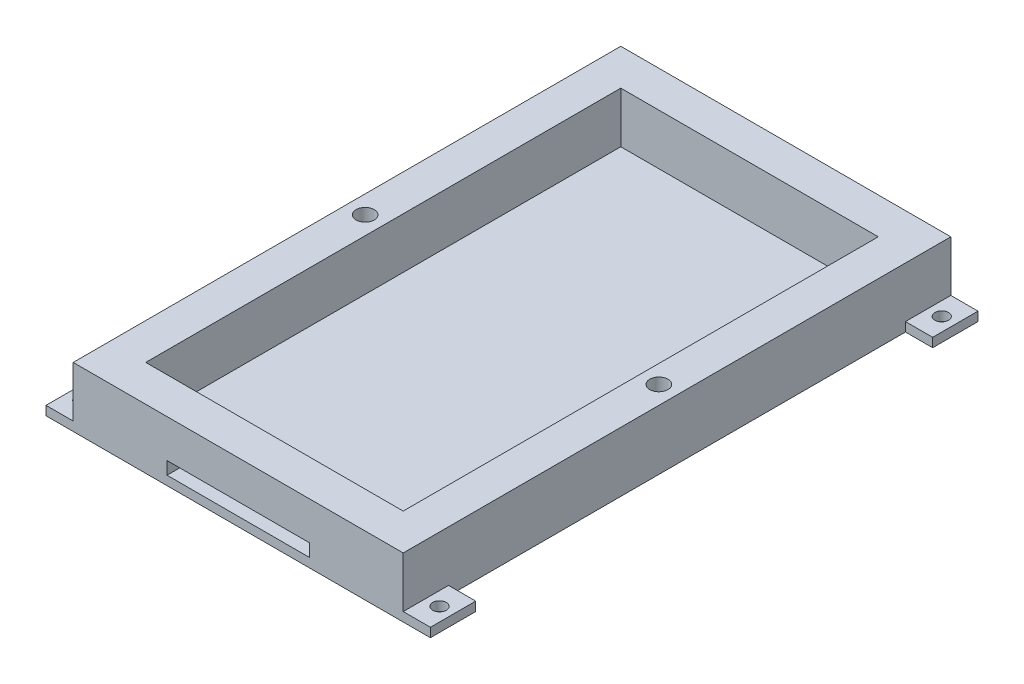
ISO-10303-21;
HEADER;
FILE_DESCRIPTION(('STEP AP214'),'2;1');
FILE_NAME('part.step','',(''),(''),'','','');
FILE_SCHEMA(('AUTOMOTIVE_DESIGN { 1 0 10303 214 1 1 1 1 }'));
ENDSEC;
DATA;
#1=APPLICATION_CONTEXT('core data for automotive mechanical design processes');
#2=APPLICATION_PROTOCOL_DEFINITION('international standard','automotive_design',2000,#1);
#3=PRODUCT_CONTEXT('',#1,'mechanical');
#4=PRODUCT('Part','Part','',(#3));
#5=PRODUCT_RELATED_PRODUCT_CATEGORY('part','',(#4));
#6=PRODUCT_DEFINITION_FORMATION('','',#4);
#7=PRODUCT_DEFINITION_CONTEXT('part definition',#1,'design');
#8=PRODUCT_DEFINITION('design','',#6,#7);
#9=PRODUCT_DEFINITION_SHAPE('','',#8);
#10=(LENGTH_UNIT() NAMED_UNIT(*) SI_UNIT(.MILLI.,.METRE.));
#11=(NAMED_UNIT(*) PLANE_ANGLE_UNIT() SI_UNIT($,.RADIAN.));
#12=(NAMED_UNIT(*) SI_UNIT($,.STERADIAN.) SOLID_ANGLE_UNIT());
#13=UNCERTAINTY_MEASURE_WITH_UNIT(LENGTH_MEASURE(1.E-05),#10,'distance_accuracy_value','');
#14=(GEOMETRIC_REPRESENTATION_CONTEXT(3) GLOBAL_UNCERTAINTY_ASSIGNED_CONTEXT((#13)) GLOBAL_UNIT_ASSIGNED_CONTEXT((#10,
#11,#12)) REPRESENTATION_CONTEXT('',''));
#15=CARTESIAN_POINT('',(0.,0.,0.));
#16=DIRECTION('',(0.,0.,1.));
#17=DIRECTION('',(1.,0.,0.));
#18=AXIS2_PLACEMENT_3D('',#15,#16,#17);
#19=CARTESIAN_POINT('',(18.2,6.6,-30.2));
#20=DIRECTION('',(-1.,0.,0.));
#21=DIRECTION('',(0.,0.,1.));
#22=AXIS2_PLACEMENT_3D('',#19,#20,#21);
#23=PLANE('',#22);
#24=DIRECTION('',(0.,-1.,0.));
#25=VECTOR('',#24,1.);
#26=CARTESIAN_POINT('',(18.2,1.,-25.2));
#27=LINE('',#26,#25);
#28=CARTESIAN_POINT('',(18.2,1.,-25.2));
#29=VERTEX_POINT('',#28);
#30=CARTESIAN_POINT('',(18.2,0.,-25.2));
#31=VERTEX_POINT('',#30);
#32=EDGE_CURVE('E260',#29,#31,#27,.T.);
#33=ORIENTED_EDGE('',*,*,#32,.F.);
#34=DIRECTION('',(0.,0.,1.));
#35=VECTOR('',#34,1.);
#36=CARTESIAN_POINT('',(18.2,1.,-30.2));
#37=LINE('',#36,#35);
#38=CARTESIAN_POINT('',(18.2,1.,-30.2));
#39=VERTEX_POINT('',#38);
#40=EDGE_CURVE('E241',#39,#29,#37,.T.);
#41=ORIENTED_EDGE('',*,*,#40,.F.);
#42=DIRECTION('',(0.,-1.,0.));
#43=VECTOR('',#42,1.);
#44=CARTESIAN_POINT('',(18.2,6.6,-30.2));
#45=LINE('',#44,#43);
#46=CARTESIAN_POINT('',(18.2,6.6,-30.2));
#47=VERTEX_POINT('',#46);
#48=EDGE_CURVE('E40',#47,#39,#45,.T.);
#49=ORIENTED_EDGE('',*,*,#48,.F.);
#50=DIRECTION('',(0.,0.,-1.));
#51=VECTOR('',#50,1.);
#52=CARTESIAN_POINT('',(18.2,6.6,-30.2));
#53=LINE('',#52,#51);
#54=CARTESIAN_POINT('',(18.2,6.6,30.2));
#55=VERTEX_POINT('',#54);
#56=EDGE_CURVE('E383',#55,#47,#53,.T.);
#57=ORIENTED_EDGE('',*,*,#56,.F.);
#58=DIRECTION('',(0.,-1.,0.));
#59=VECTOR('',#58,1.);
#60=CARTESIAN_POINT('',(18.2,6.6,30.2));
#61=LINE('',#60,#59);
#62=CARTESIAN_POINT('',(18.2,1.,30.2));
#63=VERTEX_POINT('',#62);
#64=EDGE_CURVE('E393',#55,#63,#61,.T.);
#65=ORIENTED_EDGE('',*,*,#64,.T.);
#66=DIRECTION('',(0.,0.,1.));
#67=VECTOR('',#66,1.);
#68=CARTESIAN_POINT('',(18.2,1.,30.2));
#69=LINE('',#68,#67);
#70=CARTESIAN_POINT('',(18.2,1.,25.2));
#71=VERTEX_POINT('',#70);
#72=EDGE_CURVE('E270',#71,#63,#69,.T.);
#73=ORIENTED_EDGE('',*,*,#72,.F.);
#74=DIRECTION('',(0.,-1.,0.));
#75=VECTOR('',#74,1.);
#76=CARTESIAN_POINT('',(18.2,1.,25.2));
#77=LINE('',#76,#75);
#78=CARTESIAN_POINT('',(18.2,0.,25.2));
#79=VERTEX_POINT('',#78);
#80=EDGE_CURVE('E280',#71,#79,#77,.T.);
#81=ORIENTED_EDGE('',*,*,#80,.T.);
#82=DIRECTION('',(0.,0.,-1.));
#83=VECTOR('',#82,1.);
#84=CARTESIAN_POINT('',(18.2,0.,-30.2));
#85=LINE('',#84,#83);
#86=EDGE_CURVE('E382',#79,#31,#85,.T.);
#87=ORIENTED_EDGE('',*,*,#86,.T.);
#88=EDGE_LOOP('',(#33,#41,#49,#57,#65,#73,#81,#87));
#89=FACE_BOUND('',#88,.T.);
#90=ADVANCED_FACE('F33',(#89),#23,.F.);
#91=CARTESIAN_POINT('',(-18.2,6.6,-30.2));
#92=DIRECTION('',(1.,0.,0.));
#93=DIRECTION('',(0.,0.,-1.));
#94=AXIS2_PLACEMENT_3D('',#91,#92,#93);
#95=PLANE('',#94);
#96=DIRECTION('',(0.,-1.,0.));
#97=VECTOR('',#96,1.);
#98=CARTESIAN_POINT('',(-18.2,1.,25.2));
#99=LINE('',#98,#97);
#100=CARTESIAN_POINT('',(-18.2,1.,25.2));
#101=VERTEX_POINT('',#100);
#102=CARTESIAN_POINT('',(-18.2,0.,25.2));
#103=VERTEX_POINT('',#102);
#104=EDGE_CURVE('E317',#101,#103,#99,.T.);
#105=ORIENTED_EDGE('',*,*,#104,.F.);
#106=DIRECTION('',(0.,0.,-1.));
#107=VECTOR('',#106,1.);
#108=CARTESIAN_POINT('',(-18.2,1.,30.2));
#109=LINE('',#108,#107);
#110=CARTESIAN_POINT('',(-18.2,1.,30.2));
#111=VERTEX_POINT('',#110);
#112=EDGE_CURVE('E298',#111,#101,#109,.T.);
#113=ORIENTED_EDGE('',*,*,#112,.F.);
#114=DIRECTION('',(0.,-1.,0.));
#115=VECTOR('',#114,1.);
#116=CARTESIAN_POINT('',(-18.2,6.6,30.2));
#117=LINE('',#116,#115);
#118=CARTESIAN_POINT('',(-18.2,6.6,30.2));
#119=VERTEX_POINT('',#118);
#120=EDGE_CURVE('E404',#119,#111,#117,.T.);
#121=ORIENTED_EDGE('',*,*,#120,.F.);
#122=DIRECTION('',(0.,0.,1.));
#123=VECTOR('',#122,1.);
#124=CARTESIAN_POINT('',(-18.2,6.6,-30.2));
#125=LINE('',#124,#123);
#126=CARTESIAN_POINT('',(-18.2,6.6,-30.2));
#127=VERTEX_POINT('',#126);
#128=EDGE_CURVE('E389',#127,#119,#125,.T.);
#129=ORIENTED_EDGE('',*,*,#128,.F.);
#130=DIRECTION('',(0.,-1.,0.));
#131=VECTOR('',#130,1.);
#132=CARTESIAN_POINT('',(-18.2,6.6,-30.2));
#133=LINE('',#132,#131);
#134=CARTESIAN_POINT('',(-18.2,1.,-30.2));
#135=VERTEX_POINT('',#134);
#136=EDGE_CURVE('E407',#127,#135,#133,.T.);
#137=ORIENTED_EDGE('',*,*,#136,.T.);
#138=DIRECTION('',(0.,0.,-1.));
#139=VECTOR('',#138,1.);
#140=CARTESIAN_POINT('',(-18.2,1.,-30.2));
#141=LINE('',#140,#139);
#142=CARTESIAN_POINT('',(-18.2,1.,-25.2));
#143=VERTEX_POINT('',#142);
#144=EDGE_CURVE('E327',#143,#135,#141,.T.);
#145=ORIENTED_EDGE('',*,*,#144,.F.);
#146=DIRECTION('',(0.,-1.,0.));
#147=VECTOR('',#146,1.);
#148=CARTESIAN_POINT('',(-18.2,1.,-25.2));
#149=LINE('',#148,#147);
#150=CARTESIAN_POINT('',(-18.2,0.,-25.2));
#151=VERTEX_POINT('',#150);
#152=EDGE_CURVE('E337',#143,#151,#149,.T.);
#153=ORIENTED_EDGE('',*,*,#152,.T.);
#154=DIRECTION('',(0.,0.,1.));
#155=VECTOR('',#154,1.);
#156=CARTESIAN_POINT('',(-18.2,0.,-30.2));
#157=LINE('',#156,#155);
#158=EDGE_CURVE('E398',#151,#103,#157,.T.);
#159=ORIENTED_EDGE('',*,*,#158,.T.);
#160=EDGE_LOOP('',(#105,#113,#121,#129,#137,#145,#153,#159));
#161=FACE_BOUND('',#160,.T.);
#162=ADVANCED_FACE('F447',(#161),#95,.F.);
#163=CARTESIAN_POINT('',(0.,6.6,0.));
#164=DIRECTION('',(0.,1.,0.));
#165=DIRECTION('',(0.,0.,1.));
#166=AXIS2_PLACEMENT_3D('',#163,#164,#165);
#167=PLANE('',#166);
#168=CARTESIAN_POINT('',(-16.2,6.6,0.));
#169=DIRECTION('',(0.,1.,0.));
#170=DIRECTION('',(0.,0.,1.));
#171=AXIS2_PLACEMENT_3D('',#168,#169,#170);
#172=CIRCLE('',#171,1.);
#173=CARTESIAN_POINT('',(-16.2,6.6,1.00000000000001));
#174=VERTEX_POINT('',#173);
#175=EDGE_CURVE('E227',#174,#174,#172,.T.);
#176=ORIENTED_EDGE('',*,*,#175,.F.);
#177=EDGE_LOOP('',(#176));
#178=FACE_BOUND('',#177,.T.);
#179=CARTESIAN_POINT('',(16.2,6.6,0.));
#180=DIRECTION('',(0.,1.,0.));
#181=DIRECTION('',(0.,0.,1.));
#182=AXIS2_PLACEMENT_3D('',#179,#180,#181);
#183=CIRCLE('',#182,1.);
#184=CARTESIAN_POINT('',(16.2,6.6,1.00000000000001));
#185=VERTEX_POINT('',#184);
#186=EDGE_CURVE('E222',#185,#185,#183,.T.);
#187=ORIENTED_EDGE('',*,*,#186,.F.);
#188=EDGE_LOOP('',(#187));
#189=FACE_BOUND('',#188,.T.);
#190=ORIENTED_EDGE('',*,*,#56,.T.);
#191=DIRECTION('',(-1.,0.,0.));
#192=VECTOR('',#191,1.);
#193=CARTESIAN_POINT('',(-18.2,6.6,-30.2));
#194=LINE('',#193,#192);
#195=EDGE_CURVE('E386',#47,#127,#194,.T.);
#196=ORIENTED_EDGE('',*,*,#195,.T.);
#197=ORIENTED_EDGE('',*,*,#128,.T.);
#198=DIRECTION('',(1.,0.,0.));
#199=VECTOR('',#198,1.);
#200=CARTESIAN_POINT('',(-18.2,6.6,30.2));
#201=LINE('',#200,#199);
#202=EDGE_CURVE('E391',#119,#55,#201,.T.);
#203=ORIENTED_EDGE('',*,*,#202,.T.);
#204=EDGE_LOOP('',(#190,#196,#197,#203));
#205=FACE_BOUND('',#204,.T.);
#206=DIRECTION('',(-1.,0.,0.));
#207=VECTOR('',#206,1.);
#208=CARTESIAN_POINT('',(-14.2,6.6,-26.2));
#209=LINE('',#208,#207);
#210=CARTESIAN_POINT('',(14.2,6.6,-26.2));
#211=VERTEX_POINT('',#210);
#212=CARTESIAN_POINT('',(-14.2,6.6,-26.2));
#213=VERTEX_POINT('',#212);
#214=EDGE_CURVE('E363',#211,#213,#209,.T.);
#215=ORIENTED_EDGE('',*,*,#214,.F.);
#216=DIRECTION('',(0.,0.,-1.));
#217=VECTOR('',#216,1.);
#218=CARTESIAN_POINT('',(14.2,6.6,-26.2));
#219=LINE('',#218,#217);
#220=CARTESIAN_POINT('',(14.2,6.6,26.2));
#221=VERTEX_POINT('',#220);
#222=EDGE_CURVE('E361',#221,#211,#219,.T.);
#223=ORIENTED_EDGE('',*,*,#222,.F.);
#224=DIRECTION('',(1.,0.,0.));
#225=VECTOR('',#224,1.);
#226=CARTESIAN_POINT('',(-14.2,6.6,26.2));
#227=LINE('',#226,#225);
#228=CARTESIAN_POINT('',(-14.2,6.6,26.2));
#229=VERTEX_POINT('',#228);
#230=EDGE_CURVE('E368',#229,#221,#227,.T.);
#231=ORIENTED_EDGE('',*,*,#230,.F.);
#232=DIRECTION('',(0.,0.,1.));
#233=VECTOR('',#232,1.);
#234=CARTESIAN_POINT('',(-14.2,6.6,-26.2));
#235=LINE('',#234,#233);
#236=EDGE_CURVE('E365',#213,#229,#235,.T.);
#237=ORIENTED_EDGE('',*,*,#236,.F.);
#238=EDGE_LOOP('',(#215,#223,#231,#237));
#239=FACE_BOUND('',#238,.T.);
#240=ADVANCED_FACE('F456',(#178,#189,#205,#239),#167,.T.);
#241=CARTESIAN_POINT('',(0.,0.,0.));
#242=DIRECTION('',(0.,1.,0.));
#243=DIRECTION('',(0.,0.,1.));
#244=AXIS2_PLACEMENT_3D('',#241,#242,#243);
#245=PLANE('',#244);
#246=ORIENTED_EDGE('',*,*,#86,.F.);
#247=DIRECTION('',(-1.,0.,0.));
#248=VECTOR('',#247,1.);
#249=CARTESIAN_POINT('',(18.2,0.,25.2));
#250=LINE('',#249,#248);
#251=CARTESIAN_POINT('',(21.2,0.,25.2));
#252=VERTEX_POINT('',#251);
#253=EDGE_CURVE('E274',#252,#79,#250,.T.);
#254=ORIENTED_EDGE('',*,*,#253,.F.);
#255=DIRECTION('',(0.,0.,-1.));
#256=VECTOR('',#255,1.);
#257=CARTESIAN_POINT('',(21.2,0.,30.2));
#258=LINE('',#257,#256);
#259=CARTESIAN_POINT('',(21.2,0.,30.2));
#260=VERTEX_POINT('',#259);
#261=EDGE_CURVE('E267',#260,#252,#258,.T.);
#262=ORIENTED_EDGE('',*,*,#261,.F.);
#263=DIRECTION('',(1.,0.,0.));
#264=VECTOR('',#263,1.);
#265=CARTESIAN_POINT('',(-18.2,0.,30.2));
#266=LINE('',#265,#264);
#267=CARTESIAN_POINT('',(-21.2,0.,30.2));
#268=VERTEX_POINT('',#267);
#269=EDGE_CURVE('E387',#268,#260,#266,.T.);
#270=ORIENTED_EDGE('',*,*,#269,.F.);
#271=DIRECTION('',(0.,0.,1.));
#272=VECTOR('',#271,1.);
#273=CARTESIAN_POINT('',(-21.2,0.,30.2));
#274=LINE('',#273,#272);
#275=CARTESIAN_POINT('',(-21.2,0.,25.2));
#276=VERTEX_POINT('',#275);
#277=EDGE_CURVE('E302',#276,#268,#274,.T.);
#278=ORIENTED_EDGE('',*,*,#277,.F.);
#279=DIRECTION('',(-1.,0.,0.));
#280=VECTOR('',#279,1.);
#281=CARTESIAN_POINT('',(-18.2,0.,25.2));
#282=LINE('',#281,#280);
#283=EDGE_CURVE('E295',#103,#276,#282,.T.);
#284=ORIENTED_EDGE('',*,*,#283,.F.);
#285=ORIENTED_EDGE('',*,*,#158,.F.);
#286=DIRECTION('',(1.,0.,0.));
#287=VECTOR('',#286,1.);
#288=CARTESIAN_POINT('',(-18.2,0.,-25.2));
#289=LINE('',#288,#287);
#290=CARTESIAN_POINT('',(-21.2,0.,-25.2));
#291=VERTEX_POINT('',#290);
#292=EDGE_CURVE('E331',#291,#151,#289,.T.);
#293=ORIENTED_EDGE('',*,*,#292,.F.);
#294=DIRECTION('',(0.,0.,1.));
#295=VECTOR('',#294,1.);
#296=CARTESIAN_POINT('',(-21.2,0.,-30.2));
#297=LINE('',#296,#295);
#298=CARTESIAN_POINT('',(-21.2,0.,-30.2));
#299=VERTEX_POINT('',#298);
#300=EDGE_CURVE('E324',#299,#291,#297,.T.);
#301=ORIENTED_EDGE('',*,*,#300,.F.);
#302=DIRECTION('',(-1.,0.,0.));
#303=VECTOR('',#302,1.);
#304=CARTESIAN_POINT('',(-18.2,0.,-30.2));
#305=LINE('',#304,#303);
#306=CARTESIAN_POINT('',(21.2,0.,-30.2));
#307=VERTEX_POINT('',#306);
#308=EDGE_CURVE('E396',#307,#299,#305,.T.);
#309=ORIENTED_EDGE('',*,*,#308,.F.);
#310=DIRECTION('',(0.,0.,-1.));
#311=VECTOR('',#310,1.);
#312=CARTESIAN_POINT('',(21.2,0.,-30.2));
#313=LINE('',#312,#311);
#314=CARTESIAN_POINT('',(21.2,0.,-25.2));
#315=VERTEX_POINT('',#314);
#316=EDGE_CURVE('E245',#315,#307,#313,.T.);
#317=ORIENTED_EDGE('',*,*,#316,.F.);
#318=DIRECTION('',(1.,0.,0.));
#319=VECTOR('',#318,1.);
#320=CARTESIAN_POINT('',(18.2,0.,-25.2));
#321=LINE('',#320,#319);
#322=EDGE_CURVE('E238',#31,#315,#321,.T.);
#323=ORIENTED_EDGE('',*,*,#322,.F.);
#324=EDGE_LOOP('',(#246,#254,#262,#270,#278,#284,#285,#293,#301,#309,#317,#323));
#325=FACE_BOUND('',#324,.T.);
#326=CARTESIAN_POINT('',(-19.7,0.,-27.7));
#327=DIRECTION('',(0.,1.,0.));
#328=DIRECTION('',(0.,0.,1.));
#329=AXIS2_PLACEMENT_3D('',#326,#327,#328);
#330=CIRCLE('',#329,0.750000000000002);
#331=CARTESIAN_POINT('',(-19.7,0.,-26.95));
#332=VERTEX_POINT('',#331);
#333=EDGE_CURVE('E320',#332,#332,#330,.T.);
#334=ORIENTED_EDGE('',*,*,#333,.T.);
#335=EDGE_LOOP('',(#334));
#336=FACE_BOUND('',#335,.T.);
#337=CARTESIAN_POINT('',(-19.7,0.,27.7));
#338=DIRECTION('',(0.,1.,0.));
#339=DIRECTION('',(0.,0.,1.));
#340=AXIS2_PLACEMENT_3D('',#337,#338,#339);
#341=CIRCLE('',#340,0.750000000000002);
#342=CARTESIAN_POINT('',(-19.7,0.,28.45));
#343=VERTEX_POINT('',#342);
#344=EDGE_CURVE('E291',#343,#343,#341,.T.);
#345=ORIENTED_EDGE('',*,*,#344,.T.);
#346=EDGE_LOOP('',(#345));
#347=FACE_BOUND('',#346,.T.);
#348=CARTESIAN_POINT('',(19.7,0.,27.7));
#349=DIRECTION('',(0.,1.,0.));
#350=DIRECTION('',(0.,0.,1.));
#351=AXIS2_PLACEMENT_3D('',#348,#349,#350);
#352=CIRCLE('',#351,0.750000000000002);
#353=CARTESIAN_POINT('',(19.7,0.,28.45));
#354=VERTEX_POINT('',#353);
#355=EDGE_CURVE('E263',#354,#354,#352,.T.);
#356=ORIENTED_EDGE('',*,*,#355,.T.);
#357=EDGE_LOOP('',(#356));
#358=FACE_BOUND('',#357,.T.);
#359=CARTESIAN_POINT('',(19.7,0.,-27.7));
#360=DIRECTION('',(0.,1.,0.));
#361=DIRECTION('',(0.,0.,1.));
#362=AXIS2_PLACEMENT_3D('',#359,#360,#361);
#363=CIRCLE('',#362,0.750000000000002);
#364=CARTESIAN_POINT('',(19.7,0.,-26.95));
#365=VERTEX_POINT('',#364);
#366=EDGE_CURVE('E226',#365,#365,#363,.T.);
#367=ORIENTED_EDGE('',*,*,#366,.T.);
#368=EDGE_LOOP('',(#367));
#369=FACE_BOUND('',#368,.T.);
#370=ADVANCED_FACE('F437',(#325,#336,#347,#358,#369),#245,.F.);
#371=CARTESIAN_POINT('',(-18.2,6.6,-30.2));
#372=DIRECTION('',(0.,0.,1.));
#373=DIRECTION('',(1.,0.,0.));
#374=AXIS2_PLACEMENT_3D('',#371,#372,#373);
#375=PLANE('',#374);
#376=ORIENTED_EDGE('',*,*,#308,.T.);
#377=DIRECTION('',(0.,-1.,0.));
#378=VECTOR('',#377,1.);
#379=CARTESIAN_POINT('',(-21.2,1.,-30.2));
#380=LINE('',#379,#378);
#381=CARTESIAN_POINT('',(-21.2,1.,-30.2));
#382=VERTEX_POINT('',#381);
#383=EDGE_CURVE('E345',#382,#299,#380,.T.);
#384=ORIENTED_EDGE('',*,*,#383,.F.);
#385=DIRECTION('',(-1.,0.,0.));
#386=VECTOR('',#385,1.);
#387=CARTESIAN_POINT('',(-18.2,1.,-30.2));
#388=LINE('',#387,#386);
#389=EDGE_CURVE('E330',#135,#382,#388,.T.);
#390=ORIENTED_EDGE('',*,*,#389,.F.);
#391=ORIENTED_EDGE('',*,*,#136,.F.);
#392=ORIENTED_EDGE('',*,*,#195,.F.);
#393=ORIENTED_EDGE('',*,*,#48,.T.);
#394=DIRECTION('',(-1.,0.,0.));
#395=VECTOR('',#394,1.);
#396=CARTESIAN_POINT('',(18.2,1.,-30.2));
#397=LINE('',#396,#395);
#398=CARTESIAN_POINT('',(21.2,1.,-30.2));
#399=VERTEX_POINT('',#398);
#400=EDGE_CURVE('E249',#399,#39,#397,.T.);
#401=ORIENTED_EDGE('',*,*,#400,.F.);
#402=DIRECTION('',(0.,-1.,0.));
#403=VECTOR('',#402,1.);
#404=CARTESIAN_POINT('',(21.2,1.,-30.2));
#405=LINE('',#404,#403);
#406=EDGE_CURVE('E251',#399,#307,#405,.T.);
#407=ORIENTED_EDGE('',*,*,#406,.T.);
#408=EDGE_LOOP('',(#376,#384,#390,#391,#392,#393,#401,#407));
#409=FACE_BOUND('',#408,.T.);
#410=ADVANCED_FACE('F413',(#409),#375,.F.);
#411=CARTESIAN_POINT('',(-18.2,6.6,30.2));
#412=DIRECTION('',(0.,0.,-1.));
#413=DIRECTION('',(-1.,0.,0.));
#414=AXIS2_PLACEMENT_3D('',#411,#412,#413);
#415=PLANE('',#414);
#416=DIRECTION('',(-1.,0.,0.));
#417=VECTOR('',#416,1.);
#418=CARTESIAN_POINT('',(7.85,2.4,30.2));
#419=LINE('',#418,#417);
#420=CARTESIAN_POINT('',(7.85,2.4,30.2));
#421=VERTEX_POINT('',#420);
#422=CARTESIAN_POINT('',(-7.85,2.4,30.2));
#423=VERTEX_POINT('',#422);
#424=EDGE_CURVE('E203',#421,#423,#419,.T.);
#425=ORIENTED_EDGE('',*,*,#424,.F.);
#426=DIRECTION('',(0.,1.,0.));
#427=VECTOR('',#426,1.);
#428=CARTESIAN_POINT('',(7.85,1.,30.2));
#429=LINE('',#428,#427);
#430=CARTESIAN_POINT('',(7.85,1.,30.2));
#431=VERTEX_POINT('',#430);
#432=EDGE_CURVE('E47',#431,#421,#429,.T.);
#433=ORIENTED_EDGE('',*,*,#432,.F.);
#434=DIRECTION('',(1.,0.,0.));
#435=VECTOR('',#434,1.);
#436=CARTESIAN_POINT('',(7.85,1.,30.2));
#437=LINE('',#436,#435);
#438=CARTESIAN_POINT('',(-7.85,0.999999999999997,30.2));
#439=VERTEX_POINT('',#438);
#440=EDGE_CURVE('E210',#439,#431,#437,.T.);
#441=ORIENTED_EDGE('',*,*,#440,.F.);
#442=DIRECTION('',(0.,-1.,0.));
#443=VECTOR('',#442,1.);
#444=CARTESIAN_POINT('',(-7.85,0.999999999999997,30.2));
#445=LINE('',#444,#443);
#446=EDGE_CURVE('E194',#423,#439,#445,.T.);
#447=ORIENTED_EDGE('',*,*,#446,.F.);
#448=EDGE_LOOP('',(#425,#433,#441,#447));
#449=FACE_BOUND('',#448,.T.);
#450=ORIENTED_EDGE('',*,*,#269,.T.);
#451=DIRECTION('',(0.,-1.,0.));
#452=VECTOR('',#451,1.);
#453=CARTESIAN_POINT('',(21.2,1.,30.2));
#454=LINE('',#453,#452);
#455=CARTESIAN_POINT('',(21.2,1.,30.2));
#456=VERTEX_POINT('',#455);
#457=EDGE_CURVE('E288',#456,#260,#454,.T.);
#458=ORIENTED_EDGE('',*,*,#457,.F.);
#459=DIRECTION('',(1.,0.,0.));
#460=VECTOR('',#459,1.);
#461=CARTESIAN_POINT('',(18.2,1.,30.2));
#462=LINE('',#461,#460);
#463=EDGE_CURVE('E273',#63,#456,#462,.T.);
#464=ORIENTED_EDGE('',*,*,#463,.F.);
#465=ORIENTED_EDGE('',*,*,#64,.F.);
#466=ORIENTED_EDGE('',*,*,#202,.F.);
#467=ORIENTED_EDGE('',*,*,#120,.T.);
#468=DIRECTION('',(1.,0.,0.));
#469=VECTOR('',#468,1.);
#470=CARTESIAN_POINT('',(-18.2,1.,30.2));
#471=LINE('',#470,#469);
#472=CARTESIAN_POINT('',(-21.2,1.,30.2));
#473=VERTEX_POINT('',#472);
#474=EDGE_CURVE('E306',#473,#111,#471,.T.);
#475=ORIENTED_EDGE('',*,*,#474,.F.);
#476=DIRECTION('',(0.,-1.,0.));
#477=VECTOR('',#476,1.);
#478=CARTESIAN_POINT('',(-21.2,1.,30.2));
#479=LINE('',#478,#477);
#480=EDGE_CURVE('E308',#473,#268,#479,.T.);
#481=ORIENTED_EDGE('',*,*,#480,.T.);
#482=EDGE_LOOP('',(#450,#458,#464,#465,#466,#467,#475,#481));
#483=FACE_BOUND('',#482,.T.);
#484=ADVANCED_FACE('F207',(#449,#483),#415,.F.);
#485=CARTESIAN_POINT('',(14.2,6.6,-26.2));
#486=DIRECTION('',(-1.,0.,0.));
#487=DIRECTION('',(0.,0.,1.));
#488=AXIS2_PLACEMENT_3D('',#485,#486,#487);
#489=PLANE('',#488);
#490=DIRECTION('',(0.,0.,-1.));
#491=VECTOR('',#490,1.);
#492=CARTESIAN_POINT('',(14.2,1.,26.2));
#493=LINE('',#492,#491);
#494=CARTESIAN_POINT('',(14.2,1.,26.2));
#495=VERTEX_POINT('',#494);
#496=CARTESIAN_POINT('',(14.2,1.,-26.2));
#497=VERTEX_POINT('',#496);
#498=EDGE_CURVE('E355',#495,#497,#493,.T.);
#499=ORIENTED_EDGE('',*,*,#498,.F.);
#500=DIRECTION('',(0.,-1.,0.));
#501=VECTOR('',#500,1.);
#502=CARTESIAN_POINT('',(14.2,6.6,26.2));
#503=LINE('',#502,#501);
#504=EDGE_CURVE('E370',#221,#495,#503,.T.);
#505=ORIENTED_EDGE('',*,*,#504,.F.);
#506=ORIENTED_EDGE('',*,*,#222,.T.);
#507=DIRECTION('',(0.,-1.,0.));
#508=VECTOR('',#507,1.);
#509=CARTESIAN_POINT('',(14.2,6.6,-26.2));
#510=LINE('',#509,#508);
#511=EDGE_CURVE('E379',#211,#497,#510,.T.);
#512=ORIENTED_EDGE('',*,*,#511,.T.);
#513=EDGE_LOOP('',(#499,#505,#506,#512));
#514=FACE_BOUND('',#513,.T.);
#515=ADVANCED_FACE('F502',(#514),#489,.T.);
#516=CARTESIAN_POINT('',(-14.2,6.6,-26.2));
#517=DIRECTION('',(0.,0.,1.));
#518=DIRECTION('',(1.,0.,0.));
#519=AXIS2_PLACEMENT_3D('',#516,#517,#518);
#520=PLANE('',#519);
#521=DIRECTION('',(-1.,0.,0.));
#522=VECTOR('',#521,1.);
#523=CARTESIAN_POINT('',(14.2,1.,-26.2));
#524=LINE('',#523,#522);
#525=CARTESIAN_POINT('',(-14.2,1.,-26.2));
#526=VERTEX_POINT('',#525);
#527=EDGE_CURVE('E358',#497,#526,#524,.T.);
#528=ORIENTED_EDGE('',*,*,#527,.F.);
#529=ORIENTED_EDGE('',*,*,#511,.F.);
#530=ORIENTED_EDGE('',*,*,#214,.T.);
#531=DIRECTION('',(0.,-1.,0.));
#532=VECTOR('',#531,1.);
#533=CARTESIAN_POINT('',(-14.2,6.6,-26.2));
#534=LINE('',#533,#532);
#535=EDGE_CURVE('E376',#213,#526,#534,.T.);
#536=ORIENTED_EDGE('',*,*,#535,.T.);
#537=EDGE_LOOP('',(#528,#529,#530,#536));
#538=FACE_BOUND('',#537,.T.);
#539=ADVANCED_FACE('F508',(#538),#520,.T.);
#540=CARTESIAN_POINT('',(-14.2,6.6,-26.2));
#541=DIRECTION('',(1.,0.,0.));
#542=DIRECTION('',(0.,0.,-1.));
#543=AXIS2_PLACEMENT_3D('',#540,#541,#542);
#544=PLANE('',#543);
#545=DIRECTION('',(0.,0.,1.));
#546=VECTOR('',#545,1.);
#547=CARTESIAN_POINT('',(-14.2,1.,26.2));
#548=LINE('',#547,#546);
#549=CARTESIAN_POINT('',(-14.2,1.,26.2));
#550=VERTEX_POINT('',#549);
#551=EDGE_CURVE('E348',#526,#550,#548,.T.);
#552=ORIENTED_EDGE('',*,*,#551,.F.);
#553=ORIENTED_EDGE('',*,*,#535,.F.);
#554=ORIENTED_EDGE('',*,*,#236,.T.);
#555=DIRECTION('',(0.,-1.,0.));
#556=VECTOR('',#555,1.);
#557=CARTESIAN_POINT('',(-14.2,6.6,26.2));
#558=LINE('',#557,#556);
#559=EDGE_CURVE('E373',#229,#550,#558,.T.);
#560=ORIENTED_EDGE('',*,*,#559,.T.);
#561=EDGE_LOOP('',(#552,#553,#554,#560));
#562=FACE_BOUND('',#561,.T.);
#563=ADVANCED_FACE('F512',(#562),#544,.T.);
#564=CARTESIAN_POINT('',(-14.2,6.6,26.2));
#565=DIRECTION('',(0.,0.,-1.));
#566=DIRECTION('',(-1.,0.,0.));
#567=AXIS2_PLACEMENT_3D('',#564,#565,#566);
#568=PLANE('',#567);
#569=DIRECTION('',(0.,-1.,0.));
#570=VECTOR('',#569,1.);
#571=CARTESIAN_POINT('',(7.85,6.6,26.2));
#572=LINE('',#571,#570);
#573=CARTESIAN_POINT('',(7.85,2.4,26.2));
#574=VERTEX_POINT('',#573);
#575=CARTESIAN_POINT('',(7.85,1.,26.2));
#576=VERTEX_POINT('',#575);
#577=EDGE_CURVE('E220',#574,#576,#572,.T.);
#578=ORIENTED_EDGE('',*,*,#577,.F.);
#579=DIRECTION('',(1.,0.,0.));
#580=VECTOR('',#579,1.);
#581=CARTESIAN_POINT('',(-14.2,2.4,26.2));
#582=LINE('',#581,#580);
#583=CARTESIAN_POINT('',(-7.85,2.4,26.2));
#584=VERTEX_POINT('',#583);
#585=EDGE_CURVE('E11',#584,#574,#582,.T.);
#586=ORIENTED_EDGE('',*,*,#585,.F.);
#587=DIRECTION('',(0.,1.,0.));
#588=VECTOR('',#587,1.);
#589=CARTESIAN_POINT('',(-7.85,6.6,26.2));
#590=LINE('',#589,#588);
#591=CARTESIAN_POINT('',(-7.85,0.999999999999997,26.2));
#592=VERTEX_POINT('',#591);
#593=EDGE_CURVE('E197',#592,#584,#590,.T.);
#594=ORIENTED_EDGE('',*,*,#593,.F.);
#595=DIRECTION('',(1.,0.,0.));
#596=VECTOR('',#595,1.);
#597=CARTESIAN_POINT('',(14.2,1.,26.2));
#598=LINE('',#597,#596);
#599=EDGE_CURVE('E352',#550,#592,#598,.T.);
#600=ORIENTED_EDGE('',*,*,#599,.F.);
#601=ORIENTED_EDGE('',*,*,#559,.F.);
#602=ORIENTED_EDGE('',*,*,#230,.T.);
#603=ORIENTED_EDGE('',*,*,#504,.T.);
#604=EDGE_CURVE('E351',#576,#495,#598,.T.);
#605=ORIENTED_EDGE('',*,*,#604,.F.);
#606=EDGE_LOOP('',(#578,#586,#594,#600,#601,#602,#603,#605));
#607=FACE_BOUND('',#606,.T.);
#608=ADVANCED_FACE('F516',(#607),#568,.T.);
#609=CARTESIAN_POINT('',(0.,1.,0.));
#610=DIRECTION('',(0.,1.,0.));
#611=DIRECTION('',(0.,0.,1.));
#612=AXIS2_PLACEMENT_3D('',#609,#610,#611);
#613=PLANE('',#612);
#614=ORIENTED_EDGE('',*,*,#599,.T.);
#615=DIRECTION('',(0.,0.,1.));
#616=VECTOR('',#615,1.);
#617=CARTESIAN_POINT('',(-7.85,0.999999999999997,25.2));
#618=LINE('',#617,#616);
#619=EDGE_CURVE('E199',#592,#439,#618,.T.);
#620=ORIENTED_EDGE('',*,*,#619,.T.);
#621=ORIENTED_EDGE('',*,*,#440,.T.);
#622=DIRECTION('',(0.,0.,1.));
#623=VECTOR('',#622,1.);
#624=CARTESIAN_POINT('',(7.85,1.,25.2));
#625=LINE('',#624,#623);
#626=EDGE_CURVE('E215',#576,#431,#625,.T.);
#627=ORIENTED_EDGE('',*,*,#626,.F.);
#628=ORIENTED_EDGE('',*,*,#604,.T.);
#629=ORIENTED_EDGE('',*,*,#498,.T.);
#630=ORIENTED_EDGE('',*,*,#527,.T.);
#631=ORIENTED_EDGE('',*,*,#551,.T.);
#632=EDGE_LOOP('',(#614,#620,#621,#627,#628,#629,#630,#631));
#633=FACE_BOUND('',#632,.T.);
#634=ADVANCED_FACE('F520',(#633),#613,.T.);
#635=CARTESIAN_POINT('',(0.,1.,0.));
#636=DIRECTION('',(0.,-1.,0.));
#637=DIRECTION('',(0.,0.,-1.));
#638=AXIS2_PLACEMENT_3D('',#635,#636,#637);
#639=PLANE('',#638);
#640=ORIENTED_EDGE('',*,*,#144,.T.);
#641=ORIENTED_EDGE('',*,*,#389,.T.);
#642=DIRECTION('',(0.,0.,1.));
#643=VECTOR('',#642,1.);
#644=CARTESIAN_POINT('',(-21.2,1.,-30.2));
#645=LINE('',#644,#643);
#646=CARTESIAN_POINT('',(-21.2,1.,-25.2));
#647=VERTEX_POINT('',#646);
#648=EDGE_CURVE('E333',#382,#647,#645,.T.);
#649=ORIENTED_EDGE('',*,*,#648,.T.);
#650=DIRECTION('',(1.,0.,0.));
#651=VECTOR('',#650,1.);
#652=CARTESIAN_POINT('',(-18.2,1.,-25.2));
#653=LINE('',#652,#651);
#654=EDGE_CURVE('E335',#647,#143,#653,.T.);
#655=ORIENTED_EDGE('',*,*,#654,.T.);
#656=EDGE_LOOP('',(#640,#641,#649,#655));
#657=FACE_BOUND('',#656,.T.);
#658=CARTESIAN_POINT('',(-19.7,1.,-27.7));
#659=DIRECTION('',(0.,1.,0.));
#660=DIRECTION('',(0.,0.,1.));
#661=AXIS2_PLACEMENT_3D('',#658,#659,#660);
#662=CIRCLE('',#661,0.750000000000002);
#663=CARTESIAN_POINT('',(-19.7,1.,-26.95));
#664=VERTEX_POINT('',#663);
#665=EDGE_CURVE('E321',#664,#664,#662,.T.);
#666=ORIENTED_EDGE('',*,*,#665,.F.);
#667=EDGE_LOOP('',(#666));
#668=FACE_BOUND('',#667,.T.);
#669=ADVANCED_FACE('F450',(#657,#668),#639,.F.);
#670=CARTESIAN_POINT('',(-21.2,1.,-30.2));
#671=DIRECTION('',(1.,0.,0.));
#672=DIRECTION('',(0.,0.,-1.));
#673=AXIS2_PLACEMENT_3D('',#670,#671,#672);
#674=PLANE('',#673);
#675=ORIENTED_EDGE('',*,*,#300,.T.);
#676=DIRECTION('',(0.,-1.,0.));
#677=VECTOR('',#676,1.);
#678=CARTESIAN_POINT('',(-21.2,1.,-25.2));
#679=LINE('',#678,#677);
#680=EDGE_CURVE('E342',#647,#291,#679,.T.);
#681=ORIENTED_EDGE('',*,*,#680,.F.);
#682=ORIENTED_EDGE('',*,*,#648,.F.);
#683=ORIENTED_EDGE('',*,*,#383,.T.);
#684=EDGE_LOOP('',(#675,#681,#682,#683));
#685=FACE_BOUND('',#684,.T.);
#686=ADVANCED_FACE('F433',(#685),#674,.F.);
#687=CARTESIAN_POINT('',(-18.2,1.,-25.2));
#688=DIRECTION('',(0.,0.,-1.));
#689=DIRECTION('',(-1.,0.,0.));
#690=AXIS2_PLACEMENT_3D('',#687,#688,#689);
#691=PLANE('',#690);
#692=ORIENTED_EDGE('',*,*,#292,.T.);
#693=ORIENTED_EDGE('',*,*,#152,.F.);
#694=ORIENTED_EDGE('',*,*,#654,.F.);
#695=ORIENTED_EDGE('',*,*,#680,.T.);
#696=EDGE_LOOP('',(#692,#693,#694,#695));
#697=FACE_BOUND('',#696,.T.);
#698=ADVANCED_FACE('F442',(#697),#691,.F.);
#699=CARTESIAN_POINT('',(-19.7,1.,-27.7));
#700=DIRECTION('',(0.,-1.,0.));
#701=DIRECTION('',(0.,0.,-1.));
#702=AXIS2_PLACEMENT_3D('',#699,#700,#701);
#703=CYLINDRICAL_SURFACE('',#702,0.750000000000002);
#704=ORIENTED_EDGE('',*,*,#665,.T.);
#705=EDGE_LOOP('',(#704));
#706=FACE_BOUND('',#705,.T.);
#707=ORIENTED_EDGE('',*,*,#333,.F.);
#708=EDGE_LOOP('',(#707));
#709=FACE_BOUND('',#708,.T.);
#710=ADVANCED_FACE('F529',(#706,#709),#703,.F.);
#711=CARTESIAN_POINT('',(0.,1.,0.));
#712=DIRECTION('',(0.,1.,0.));
#713=DIRECTION('',(0.,0.,1.));
#714=AXIS2_PLACEMENT_3D('',#711,#712,#713);
#715=PLANE('',#714);
#716=ORIENTED_EDGE('',*,*,#112,.T.);
#717=DIRECTION('',(-1.,0.,0.));
#718=VECTOR('',#717,1.);
#719=CARTESIAN_POINT('',(-18.2,1.,25.2));
#720=LINE('',#719,#718);
#721=CARTESIAN_POINT('',(-21.2,1.,25.2));
#722=VERTEX_POINT('',#721);
#723=EDGE_CURVE('E301',#101,#722,#720,.T.);
#724=ORIENTED_EDGE('',*,*,#723,.T.);
#725=DIRECTION('',(0.,0.,1.));
#726=VECTOR('',#725,1.);
#727=CARTESIAN_POINT('',(-21.2,1.,30.2));
#728=LINE('',#727,#726);
#729=EDGE_CURVE('E304',#722,#473,#728,.T.);
#730=ORIENTED_EDGE('',*,*,#729,.T.);
#731=ORIENTED_EDGE('',*,*,#474,.T.);
#732=EDGE_LOOP('',(#716,#724,#730,#731));
#733=FACE_BOUND('',#732,.T.);
#734=CARTESIAN_POINT('',(-19.7,1.,27.7));
#735=DIRECTION('',(0.,1.,0.));
#736=DIRECTION('',(0.,0.,1.));
#737=AXIS2_PLACEMENT_3D('',#734,#735,#736);
#738=CIRCLE('',#737,0.750000000000002);
#739=CARTESIAN_POINT('',(-19.7,1.,28.45));
#740=VERTEX_POINT('',#739);
#741=EDGE_CURVE('E292',#740,#740,#738,.T.);
#742=ORIENTED_EDGE('',*,*,#741,.F.);
#743=EDGE_LOOP('',(#742));
#744=FACE_BOUND('',#743,.T.);
#745=ADVANCED_FACE('F534',(#733,#744),#715,.T.);
#746=CARTESIAN_POINT('',(-18.2,1.,25.2));
#747=DIRECTION('',(0.,0.,1.));
#748=DIRECTION('',(1.,0.,0.));
#749=AXIS2_PLACEMENT_3D('',#746,#747,#748);
#750=PLANE('',#749);
#751=ORIENTED_EDGE('',*,*,#283,.T.);
#752=DIRECTION('',(0.,-1.,0.));
#753=VECTOR('',#752,1.);
#754=CARTESIAN_POINT('',(-21.2,1.,25.2));
#755=LINE('',#754,#753);
#756=EDGE_CURVE('E314',#722,#276,#755,.T.);
#757=ORIENTED_EDGE('',*,*,#756,.F.);
#758=ORIENTED_EDGE('',*,*,#723,.F.);
#759=ORIENTED_EDGE('',*,*,#104,.T.);
#760=EDGE_LOOP('',(#751,#757,#758,#759));
#761=FACE_BOUND('',#760,.T.);
#762=ADVANCED_FACE('F536',(#761),#750,.F.);
#763=CARTESIAN_POINT('',(-21.2,1.,30.2));
#764=DIRECTION('',(1.,0.,0.));
#765=DIRECTION('',(0.,0.,-1.));
#766=AXIS2_PLACEMENT_3D('',#763,#764,#765);
#767=PLANE('',#766);
#768=ORIENTED_EDGE('',*,*,#277,.T.);
#769=ORIENTED_EDGE('',*,*,#480,.F.);
#770=ORIENTED_EDGE('',*,*,#729,.F.);
#771=ORIENTED_EDGE('',*,*,#756,.T.);
#772=EDGE_LOOP('',(#768,#769,#770,#771));
#773=FACE_BOUND('',#772,.T.);
#774=ADVANCED_FACE('F539',(#773),#767,.F.);
#775=CARTESIAN_POINT('',(-19.7,1.,27.7));
#776=DIRECTION('',(0.,-1.,0.));
#777=DIRECTION('',(0.,0.,-1.));
#778=AXIS2_PLACEMENT_3D('',#775,#776,#777);
#779=CYLINDRICAL_SURFACE('',#778,0.750000000000002);
#780=ORIENTED_EDGE('',*,*,#741,.T.);
#781=EDGE_LOOP('',(#780));
#782=FACE_BOUND('',#781,.T.);
#783=ORIENTED_EDGE('',*,*,#344,.F.);
#784=EDGE_LOOP('',(#783));
#785=FACE_BOUND('',#784,.T.);
#786=ADVANCED_FACE('F543',(#782,#785),#779,.F.);
#787=CARTESIAN_POINT('',(0.,1.,0.));
#788=DIRECTION('',(0.,-1.,0.));
#789=DIRECTION('',(0.,0.,-1.));
#790=AXIS2_PLACEMENT_3D('',#787,#788,#789);
#791=PLANE('',#790);
#792=ORIENTED_EDGE('',*,*,#72,.T.);
#793=ORIENTED_EDGE('',*,*,#463,.T.);
#794=DIRECTION('',(0.,0.,-1.));
#795=VECTOR('',#794,1.);
#796=CARTESIAN_POINT('',(21.2,1.,30.2));
#797=LINE('',#796,#795);
#798=CARTESIAN_POINT('',(21.2,1.,25.2));
#799=VERTEX_POINT('',#798);
#800=EDGE_CURVE('E276',#456,#799,#797,.T.);
#801=ORIENTED_EDGE('',*,*,#800,.T.);
#802=DIRECTION('',(-1.,0.,0.));
#803=VECTOR('',#802,1.);
#804=CARTESIAN_POINT('',(18.2,1.,25.2));
#805=LINE('',#804,#803);
#806=EDGE_CURVE('E278',#799,#71,#805,.T.);
#807=ORIENTED_EDGE('',*,*,#806,.T.);
#808=EDGE_LOOP('',(#792,#793,#801,#807));
#809=FACE_BOUND('',#808,.T.);
#810=CARTESIAN_POINT('',(19.7,1.,27.7));
#811=DIRECTION('',(0.,1.,0.));
#812=DIRECTION('',(0.,0.,1.));
#813=AXIS2_PLACEMENT_3D('',#810,#811,#812);
#814=CIRCLE('',#813,0.750000000000002);
#815=CARTESIAN_POINT('',(19.7,1.,28.45));
#816=VERTEX_POINT('',#815);
#817=EDGE_CURVE('E264',#816,#816,#814,.T.);
#818=ORIENTED_EDGE('',*,*,#817,.F.);
#819=EDGE_LOOP('',(#818));
#820=FACE_BOUND('',#819,.T.);
#821=ADVANCED_FACE('F463',(#809,#820),#791,.F.);
#822=CARTESIAN_POINT('',(21.2,1.,30.2));
#823=DIRECTION('',(-1.,0.,0.));
#824=DIRECTION('',(0.,0.,1.));
#825=AXIS2_PLACEMENT_3D('',#822,#823,#824);
#826=PLANE('',#825);
#827=ORIENTED_EDGE('',*,*,#261,.T.);
#828=DIRECTION('',(0.,-1.,0.));
#829=VECTOR('',#828,1.);
#830=CARTESIAN_POINT('',(21.2,1.,25.2));
#831=LINE('',#830,#829);
#832=EDGE_CURVE('E285',#799,#252,#831,.T.);
#833=ORIENTED_EDGE('',*,*,#832,.F.);
#834=ORIENTED_EDGE('',*,*,#800,.F.);
#835=ORIENTED_EDGE('',*,*,#457,.T.);
#836=EDGE_LOOP('',(#827,#833,#834,#835));
#837=FACE_BOUND('',#836,.T.);
#838=ADVANCED_FACE('F551',(#837),#826,.F.);
#839=CARTESIAN_POINT('',(18.2,1.,25.2));
#840=DIRECTION('',(0.,0.,1.));
#841=DIRECTION('',(1.,0.,0.));
#842=AXIS2_PLACEMENT_3D('',#839,#840,#841);
#843=PLANE('',#842);
#844=ORIENTED_EDGE('',*,*,#253,.T.);
#845=ORIENTED_EDGE('',*,*,#80,.F.);
#846=ORIENTED_EDGE('',*,*,#806,.F.);
#847=ORIENTED_EDGE('',*,*,#832,.T.);
#848=EDGE_LOOP('',(#844,#845,#846,#847));
#849=FACE_BOUND('',#848,.T.);
#850=ADVANCED_FACE('F469',(#849),#843,.F.);
#851=CARTESIAN_POINT('',(19.7,1.,27.7));
#852=DIRECTION('',(0.,-1.,0.));
#853=DIRECTION('',(0.,0.,-1.));
#854=AXIS2_PLACEMENT_3D('',#851,#852,#853);
#855=CYLINDRICAL_SURFACE('',#854,0.750000000000002);
#856=ORIENTED_EDGE('',*,*,#817,.T.);
#857=EDGE_LOOP('',(#856));
#858=FACE_BOUND('',#857,.T.);
#859=ORIENTED_EDGE('',*,*,#355,.F.);
#860=EDGE_LOOP('',(#859));
#861=FACE_BOUND('',#860,.T.);
#862=ADVANCED_FACE('F482',(#858,#861),#855,.F.);
#863=CARTESIAN_POINT('',(0.,1.,0.));
#864=DIRECTION('',(0.,1.,0.));
#865=DIRECTION('',(0.,0.,1.));
#866=AXIS2_PLACEMENT_3D('',#863,#864,#865);
#867=PLANE('',#866);
#868=ORIENTED_EDGE('',*,*,#40,.T.);
#869=DIRECTION('',(1.,0.,0.));
#870=VECTOR('',#869,1.);
#871=CARTESIAN_POINT('',(18.2,1.,-25.2));
#872=LINE('',#871,#870);
#873=CARTESIAN_POINT('',(21.2,1.,-25.2));
#874=VERTEX_POINT('',#873);
#875=EDGE_CURVE('E244',#29,#874,#872,.T.);
#876=ORIENTED_EDGE('',*,*,#875,.T.);
#877=DIRECTION('',(0.,0.,-1.));
#878=VECTOR('',#877,1.);
#879=CARTESIAN_POINT('',(21.2,1.,-30.2));
#880=LINE('',#879,#878);
#881=EDGE_CURVE('E247',#874,#399,#880,.T.);
#882=ORIENTED_EDGE('',*,*,#881,.T.);
#883=ORIENTED_EDGE('',*,*,#400,.T.);
#884=EDGE_LOOP('',(#868,#876,#882,#883));
#885=FACE_BOUND('',#884,.T.);
#886=CARTESIAN_POINT('',(19.7,1.,-27.7));
#887=DIRECTION('',(0.,1.,0.));
#888=DIRECTION('',(0.,0.,1.));
#889=AXIS2_PLACEMENT_3D('',#886,#887,#888);
#890=CIRCLE('',#889,0.750000000000002);
#891=CARTESIAN_POINT('',(19.7,1.,-26.95));
#892=VERTEX_POINT('',#891);
#893=EDGE_CURVE('E235',#892,#892,#890,.T.);
#894=ORIENTED_EDGE('',*,*,#893,.F.);
#895=EDGE_LOOP('',(#894));
#896=FACE_BOUND('',#895,.T.);
#897=ADVANCED_FACE('F420',(#885,#896),#867,.T.);
#898=CARTESIAN_POINT('',(18.2,1.,-25.2));
#899=DIRECTION('',(0.,0.,-1.));
#900=DIRECTION('',(-1.,0.,0.));
#901=AXIS2_PLACEMENT_3D('',#898,#899,#900);
#902=PLANE('',#901);
#903=ORIENTED_EDGE('',*,*,#322,.T.);
#904=DIRECTION('',(0.,-1.,0.));
#905=VECTOR('',#904,1.);
#906=CARTESIAN_POINT('',(21.2,1.,-25.2));
#907=LINE('',#906,#905);
#908=EDGE_CURVE('E257',#874,#315,#907,.T.);
#909=ORIENTED_EDGE('',*,*,#908,.F.);
#910=ORIENTED_EDGE('',*,*,#875,.F.);
#911=ORIENTED_EDGE('',*,*,#32,.T.);
#912=EDGE_LOOP('',(#903,#909,#910,#911));
#913=FACE_BOUND('',#912,.T.);
#914=ADVANCED_FACE('F473',(#913),#902,.F.);
#915=CARTESIAN_POINT('',(21.2,1.,-30.2));
#916=DIRECTION('',(-1.,0.,0.));
#917=DIRECTION('',(0.,0.,1.));
#918=AXIS2_PLACEMENT_3D('',#915,#916,#917);
#919=PLANE('',#918);
#920=ORIENTED_EDGE('',*,*,#316,.T.);
#921=ORIENTED_EDGE('',*,*,#406,.F.);
#922=ORIENTED_EDGE('',*,*,#881,.F.);
#923=ORIENTED_EDGE('',*,*,#908,.T.);
#924=EDGE_LOOP('',(#920,#921,#922,#923));
#925=FACE_BOUND('',#924,.T.);
#926=ADVANCED_FACE('F426',(#925),#919,.F.);
#927=CARTESIAN_POINT('',(19.7,1.,-27.7));
#928=DIRECTION('',(0.,-1.,0.));
#929=DIRECTION('',(0.,0.,-1.));
#930=AXIS2_PLACEMENT_3D('',#927,#928,#929);
#931=CYLINDRICAL_SURFACE('',#930,0.750000000000002);
#932=ORIENTED_EDGE('',*,*,#893,.T.);
#933=EDGE_LOOP('',(#932));
#934=FACE_BOUND('',#933,.T.);
#935=ORIENTED_EDGE('',*,*,#366,.F.);
#936=EDGE_LOOP('',(#935));
#937=FACE_BOUND('',#936,.T.);
#938=ADVANCED_FACE('F480',(#934,#937),#931,.F.);
#939=CARTESIAN_POINT('',(16.2,2.6,0.));
#940=DIRECTION('',(0.,1.,0.));
#941=DIRECTION('',(0.,0.,1.));
#942=AXIS2_PLACEMENT_3D('',#939,#940,#941);
#943=CYLINDRICAL_SURFACE('',#942,1.);
#944=CARTESIAN_POINT('',(16.2,2.6,0.));
#945=DIRECTION('',(0.,1.,0.));
#946=DIRECTION('',(0.,0.,1.));
#947=AXIS2_PLACEMENT_3D('',#944,#945,#946);
#948=CIRCLE('',#947,1.);
#949=CARTESIAN_POINT('',(16.2,2.6,1.00000000000001));
#950=VERTEX_POINT('',#949);
#951=EDGE_CURVE('E230',#950,#950,#948,.T.);
#952=ORIENTED_EDGE('',*,*,#951,.F.);
#953=EDGE_LOOP('',(#952));
#954=FACE_BOUND('',#953,.T.);
#955=ORIENTED_EDGE('',*,*,#186,.T.);
#956=EDGE_LOOP('',(#955));
#957=FACE_BOUND('',#956,.T.);
#958=ADVANCED_FACE('F570',(#954,#957),#943,.F.);
#959=CARTESIAN_POINT('',(16.2,2.6,0.));
#960=DIRECTION('',(0.,1.,0.));
#961=DIRECTION('',(0.,0.,1.));
#962=AXIS2_PLACEMENT_3D('',#959,#960,#961);
#963=PLANE('',#962);
#964=ORIENTED_EDGE('',*,*,#951,.T.);
#965=EDGE_LOOP('',(#964));
#966=FACE_BOUND('',#965,.T.);
#967=ADVANCED_FACE('F576',(#966),#963,.T.);
#968=CARTESIAN_POINT('',(-16.2,2.6,0.));
#969=DIRECTION('',(0.,1.,0.));
#970=DIRECTION('',(0.,0.,1.));
#971=AXIS2_PLACEMENT_3D('',#968,#969,#970);
#972=CYLINDRICAL_SURFACE('',#971,1.);
#973=CARTESIAN_POINT('',(-16.2,2.6,0.));
#974=DIRECTION('',(0.,1.,0.));
#975=DIRECTION('',(0.,0.,1.));
#976=AXIS2_PLACEMENT_3D('',#973,#974,#975);
#977=CIRCLE('',#976,1.);
#978=CARTESIAN_POINT('',(-16.2,2.6,1.00000000000001));
#979=VERTEX_POINT('',#978);
#980=EDGE_CURVE('E223',#979,#979,#977,.T.);
#981=ORIENTED_EDGE('',*,*,#980,.F.);
#982=EDGE_LOOP('',(#981));
#983=FACE_BOUND('',#982,.T.);
#984=ORIENTED_EDGE('',*,*,#175,.T.);
#985=EDGE_LOOP('',(#984));
#986=FACE_BOUND('',#985,.T.);
#987=ADVANCED_FACE('F582',(#983,#986),#972,.F.);
#988=CARTESIAN_POINT('',(-16.2,2.6,0.));
#989=DIRECTION('',(0.,1.,0.));
#990=DIRECTION('',(0.,0.,1.));
#991=AXIS2_PLACEMENT_3D('',#988,#989,#990);
#992=PLANE('',#991);
#993=ORIENTED_EDGE('',*,*,#980,.T.);
#994=EDGE_LOOP('',(#993));
#995=FACE_BOUND('',#994,.T.);
#996=ADVANCED_FACE('F586',(#995),#992,.T.);
#997=CARTESIAN_POINT('',(7.85,1.,25.2));
#998=DIRECTION('',(1.,0.,0.));
#999=DIRECTION('',(0.,0.,-1.));
#1000=AXIS2_PLACEMENT_3D('',#997,#998,#999);
#1001=PLANE('',#1000);
#1002=ORIENTED_EDGE('',*,*,#577,.T.);
#1003=ORIENTED_EDGE('',*,*,#626,.T.);
#1004=ORIENTED_EDGE('',*,*,#432,.T.);
#1005=DIRECTION('',(0.,0.,1.));
#1006=VECTOR('',#1005,1.);
#1007=CARTESIAN_POINT('',(7.85,2.4,25.2));
#1008=LINE('',#1007,#1006);
#1009=EDGE_CURVE('E200',#574,#421,#1008,.T.);
#1010=ORIENTED_EDGE('',*,*,#1009,.F.);
#1011=EDGE_LOOP('',(#1002,#1003,#1004,#1010));
#1012=FACE_BOUND('',#1011,.T.);
#1013=ADVANCED_FACE('F590',(#1012),#1001,.F.);
#1014=CARTESIAN_POINT('',(-7.85,0.999999999999997,25.2));
#1015=DIRECTION('',(-1.,0.,0.));
#1016=DIRECTION('',(0.,0.,1.));
#1017=AXIS2_PLACEMENT_3D('',#1014,#1015,#1016);
#1018=PLANE('',#1017);
#1019=ORIENTED_EDGE('',*,*,#593,.T.);
#1020=DIRECTION('',(0.,0.,1.));
#1021=VECTOR('',#1020,1.);
#1022=CARTESIAN_POINT('',(-7.85,2.4,25.2));
#1023=LINE('',#1022,#1021);
#1024=EDGE_CURVE('E54',#584,#423,#1023,.T.);
#1025=ORIENTED_EDGE('',*,*,#1024,.T.);
#1026=ORIENTED_EDGE('',*,*,#446,.T.);
#1027=ORIENTED_EDGE('',*,*,#619,.F.);
#1028=EDGE_LOOP('',(#1019,#1025,#1026,#1027));
#1029=FACE_BOUND('',#1028,.T.);
#1030=ADVANCED_FACE('F192',(#1029),#1018,.F.);
#1031=CARTESIAN_POINT('',(7.85,2.4,25.2));
#1032=DIRECTION('',(0.,1.,0.));
#1033=DIRECTION('',(-1.,0.,0.));
#1034=AXIS2_PLACEMENT_3D('',#1031,#1032,#1033);
#1035=PLANE('',#1034);
#1036=ORIENTED_EDGE('',*,*,#585,.T.);
#1037=ORIENTED_EDGE('',*,*,#1009,.T.);
#1038=ORIENTED_EDGE('',*,*,#424,.T.);
#1039=ORIENTED_EDGE('',*,*,#1024,.F.);
#1040=EDGE_LOOP('',(#1036,#1037,#1038,#1039));
#1041=FACE_BOUND('',#1040,.T.);
#1042=ADVANCED_FACE('F204',(#1041),#1035,.F.);
#1043=CLOSED_SHELL('',(#90,#162,#240,#370,#410,#484,#515,#539,#563,#608,#634,#669,#686,#698,
#710,#745,#762,#774,#786,#821,#838,#850,#862,#897,#914,#926,#938,#958,#967,#987,#996,#1013,
#1030,#1042));
#1044=MANIFOLD_SOLID_BREP('B2',#1043);
#1045=ADVANCED_BREP_SHAPE_REPRESENTATION('',(#18,#1044),#14);
#1046=SHAPE_DEFINITION_REPRESENTATION(#9,#1045);
ENDSEC;
END-ISO-10303-21;
